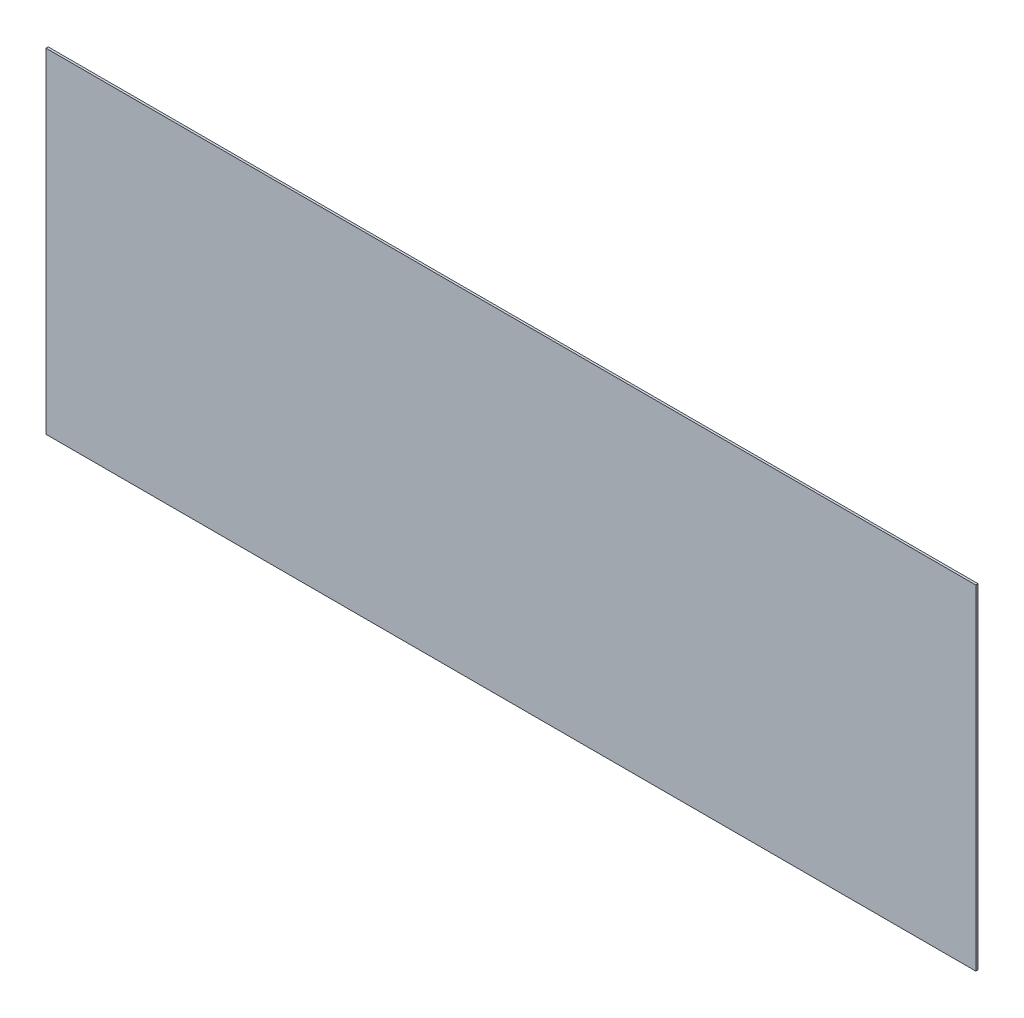
ISO-10303-21;
HEADER;
FILE_DESCRIPTION(('STEP AP214'),'2;1');
FILE_NAME('part.step','',(''),(''),'','','');
FILE_SCHEMA(('AUTOMOTIVE_DESIGN { 1 0 10303 214 1 1 1 1 }'));
ENDSEC;
DATA;
#1=APPLICATION_CONTEXT('core data for automotive mechanical design processes');
#2=APPLICATION_PROTOCOL_DEFINITION('international standard','automotive_design',2000,#1);
#3=PRODUCT_CONTEXT('',#1,'mechanical');
#4=PRODUCT('Part','Part','',(#3));
#5=PRODUCT_RELATED_PRODUCT_CATEGORY('part','',(#4));
#6=PRODUCT_DEFINITION_FORMATION('','',#4);
#7=PRODUCT_DEFINITION_CONTEXT('part definition',#1,'design');
#8=PRODUCT_DEFINITION('design','',#6,#7);
#9=PRODUCT_DEFINITION_SHAPE('','',#8);
#10=(LENGTH_UNIT() NAMED_UNIT(*) SI_UNIT(.MILLI.,.METRE.));
#11=(NAMED_UNIT(*) PLANE_ANGLE_UNIT() SI_UNIT($,.RADIAN.));
#12=(NAMED_UNIT(*) SI_UNIT($,.STERADIAN.) SOLID_ANGLE_UNIT());
#13=UNCERTAINTY_MEASURE_WITH_UNIT(LENGTH_MEASURE(1.E-05),#10,'distance_accuracy_value','');
#14=(GEOMETRIC_REPRESENTATION_CONTEXT(3) GLOBAL_UNCERTAINTY_ASSIGNED_CONTEXT((#13)) GLOBAL_UNIT_ASSIGNED_CONTEXT((#10,
#11,#12)) REPRESENTATION_CONTEXT('',''));
#15=CARTESIAN_POINT('',(0.,0.,0.));
#16=DIRECTION('',(0.,0.,1.));
#17=DIRECTION('',(1.,0.,0.));
#18=AXIS2_PLACEMENT_3D('',#15,#16,#17);
#19=CARTESIAN_POINT('',(0.,0.,1.5));
#20=DIRECTION('',(1.,0.,0.));
#21=DIRECTION('',(0.,0.,-1.));
#22=AXIS2_PLACEMENT_3D('',#19,#20,#21);
#23=PLANE('',#22);
#24=DIRECTION('',(0.,-1.,0.));
#25=VECTOR('',#24,1.);
#26=CARTESIAN_POINT('',(0.,0.,0.));
#27=LINE('',#26,#25);
#28=CARTESIAN_POINT('',(0.,223.,0.));
#29=VERTEX_POINT('',#28);
#30=CARTESIAN_POINT('',(0.,0.,0.));
#31=VERTEX_POINT('',#30);
#32=EDGE_CURVE('E100',#29,#31,#27,.T.);
#33=ORIENTED_EDGE('',*,*,#32,.T.);
#34=DIRECTION('',(0.,0.,-1.));
#35=VECTOR('',#34,1.);
#36=CARTESIAN_POINT('',(0.,0.,1.5));
#37=LINE('',#36,#35);
#38=CARTESIAN_POINT('',(0.,0.,1.5));
#39=VERTEX_POINT('',#38);
#40=EDGE_CURVE('E11',#39,#31,#37,.T.);
#41=ORIENTED_EDGE('',*,*,#40,.F.);
#42=DIRECTION('',(0.,-1.,0.));
#43=VECTOR('',#42,1.);
#44=CARTESIAN_POINT('',(0.,0.,1.5));
#45=LINE('',#44,#43);
#46=CARTESIAN_POINT('',(0.,223.,1.5));
#47=VERTEX_POINT('',#46);
#48=EDGE_CURVE('E88',#47,#39,#45,.T.);
#49=ORIENTED_EDGE('',*,*,#48,.F.);
#50=DIRECTION('',(0.,0.,-1.));
#51=VECTOR('',#50,1.);
#52=CARTESIAN_POINT('',(0.,223.,1.5));
#53=LINE('',#52,#51);
#54=EDGE_CURVE('E96',#47,#29,#53,.T.);
#55=ORIENTED_EDGE('',*,*,#54,.T.);
#56=EDGE_LOOP('',(#33,#41,#49,#55));
#57=FACE_BOUND('',#56,.T.);
#58=ADVANCED_FACE('F37',(#57),#23,.F.);
#59=CARTESIAN_POINT('',(0.,0.,1.5));
#60=DIRECTION('',(0.,1.,0.));
#61=DIRECTION('',(0.,0.,1.));
#62=AXIS2_PLACEMENT_3D('',#59,#60,#61);
#63=PLANE('',#62);
#64=DIRECTION('',(1.,0.,0.));
#65=VECTOR('',#64,1.);
#66=CARTESIAN_POINT('',(0.,0.,0.));
#67=LINE('',#66,#65);
#68=CARTESIAN_POINT('',(620.,0.,0.));
#69=VERTEX_POINT('',#68);
#70=EDGE_CURVE('E92',#31,#69,#67,.T.);
#71=ORIENTED_EDGE('',*,*,#70,.T.);
#72=DIRECTION('',(0.,0.,-1.));
#73=VECTOR('',#72,1.);
#74=CARTESIAN_POINT('',(620.,0.,1.5));
#75=LINE('',#74,#73);
#76=CARTESIAN_POINT('',(620.,0.,1.5));
#77=VERTEX_POINT('',#76);
#78=EDGE_CURVE('E45',#77,#69,#75,.T.);
#79=ORIENTED_EDGE('',*,*,#78,.F.);
#80=DIRECTION('',(1.,0.,0.));
#81=VECTOR('',#80,1.);
#82=CARTESIAN_POINT('',(0.,0.,1.5));
#83=LINE('',#82,#81);
#84=EDGE_CURVE('E83',#39,#77,#83,.T.);
#85=ORIENTED_EDGE('',*,*,#84,.F.);
#86=ORIENTED_EDGE('',*,*,#40,.T.);
#87=EDGE_LOOP('',(#71,#79,#85,#86));
#88=FACE_BOUND('',#87,.T.);
#89=ADVANCED_FACE('F91',(#88),#63,.F.);
#90=CARTESIAN_POINT('',(620.,0.,1.5));
#91=DIRECTION('',(-1.,0.,0.));
#92=DIRECTION('',(0.,0.,1.));
#93=AXIS2_PLACEMENT_3D('',#90,#91,#92);
#94=PLANE('',#93);
#95=DIRECTION('',(0.,1.,0.));
#96=VECTOR('',#95,1.);
#97=CARTESIAN_POINT('',(620.,0.,0.));
#98=LINE('',#97,#96);
#99=CARTESIAN_POINT('',(620.,223.,0.));
#100=VERTEX_POINT('',#99);
#101=EDGE_CURVE('E70',#69,#100,#98,.T.);
#102=ORIENTED_EDGE('',*,*,#101,.T.);
#103=DIRECTION('',(0.,0.,-1.));
#104=VECTOR('',#103,1.);
#105=CARTESIAN_POINT('',(620.,223.,1.5));
#106=LINE('',#105,#104);
#107=CARTESIAN_POINT('',(620.,223.,1.5));
#108=VERTEX_POINT('',#107);
#109=EDGE_CURVE('E93',#108,#100,#106,.T.);
#110=ORIENTED_EDGE('',*,*,#109,.F.);
#111=DIRECTION('',(0.,1.,0.));
#112=VECTOR('',#111,1.);
#113=CARTESIAN_POINT('',(620.,0.,1.5));
#114=LINE('',#113,#112);
#115=EDGE_CURVE('E86',#77,#108,#114,.T.);
#116=ORIENTED_EDGE('',*,*,#115,.F.);
#117=ORIENTED_EDGE('',*,*,#78,.T.);
#118=EDGE_LOOP('',(#102,#110,#116,#117));
#119=FACE_BOUND('',#118,.T.);
#120=ADVANCED_FACE('F94',(#119),#94,.F.);
#121=CARTESIAN_POINT('',(0.,223.,1.5));
#122=DIRECTION('',(0.,-1.,0.));
#123=DIRECTION('',(0.,0.,-1.));
#124=AXIS2_PLACEMENT_3D('',#121,#122,#123);
#125=PLANE('',#124);
#126=DIRECTION('',(-1.,0.,0.));
#127=VECTOR('',#126,1.);
#128=CARTESIAN_POINT('',(0.,223.,0.));
#129=LINE('',#128,#127);
#130=EDGE_CURVE('E76',#100,#29,#129,.T.);
#131=ORIENTED_EDGE('',*,*,#130,.T.);
#132=ORIENTED_EDGE('',*,*,#54,.F.);
#133=DIRECTION('',(-1.,0.,0.));
#134=VECTOR('',#133,1.);
#135=CARTESIAN_POINT('',(0.,223.,1.5));
#136=LINE('',#135,#134);
#137=EDGE_CURVE('E53',#108,#47,#136,.T.);
#138=ORIENTED_EDGE('',*,*,#137,.F.);
#139=ORIENTED_EDGE('',*,*,#109,.T.);
#140=EDGE_LOOP('',(#131,#132,#138,#139));
#141=FACE_BOUND('',#140,.T.);
#142=ADVANCED_FACE('F107',(#141),#125,.F.);
#143=CARTESIAN_POINT('',(0.,0.,1.5));
#144=DIRECTION('',(0.,0.,-1.));
#145=DIRECTION('',(-1.,0.,0.));
#146=AXIS2_PLACEMENT_3D('',#143,#144,#145);
#147=PLANE('',#146);
#148=ORIENTED_EDGE('',*,*,#48,.T.);
#149=ORIENTED_EDGE('',*,*,#84,.T.);
#150=ORIENTED_EDGE('',*,*,#115,.T.);
#151=ORIENTED_EDGE('',*,*,#137,.T.);
#152=EDGE_LOOP('',(#148,#149,#150,#151));
#153=FACE_BOUND('',#152,.T.);
#154=ADVANCED_FACE('F84',(#153),#147,.F.);
#155=CARTESIAN_POINT('',(0.,0.,0.));
#156=DIRECTION('',(0.,0.,-1.));
#157=DIRECTION('',(-1.,0.,0.));
#158=AXIS2_PLACEMENT_3D('',#155,#156,#157);
#159=PLANE('',#158);
#160=ORIENTED_EDGE('',*,*,#32,.F.);
#161=ORIENTED_EDGE('',*,*,#130,.F.);
#162=ORIENTED_EDGE('',*,*,#101,.F.);
#163=ORIENTED_EDGE('',*,*,#70,.F.);
#164=EDGE_LOOP('',(#160,#161,#162,#163));
#165=FACE_BOUND('',#164,.T.);
#166=ADVANCED_FACE('F110',(#165),#159,.T.);
#167=CLOSED_SHELL('',(#58,#89,#120,#142,#154,#166));
#168=MANIFOLD_SOLID_BREP('B2',#167);
#169=ADVANCED_BREP_SHAPE_REPRESENTATION('',(#18,#168),#14);
#170=SHAPE_DEFINITION_REPRESENTATION(#9,#169);
ENDSEC;
END-ISO-10303-21;
